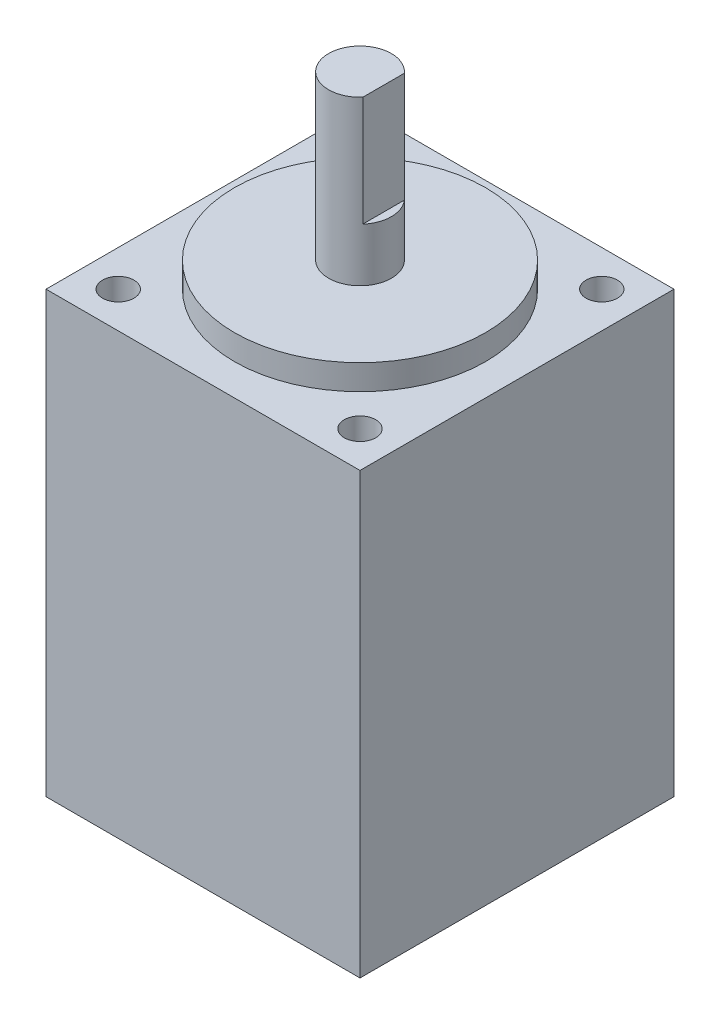
ISO-10303-21;
HEADER;
FILE_DESCRIPTION(('STEP AP214'),'2;1');
FILE_NAME('part.step','',(''),(''),'','','');
FILE_SCHEMA(('AUTOMOTIVE_DESIGN { 1 0 10303 214 1 1 1 1 }'));
ENDSEC;
DATA;
#1=APPLICATION_CONTEXT('core data for automotive mechanical design processes');
#2=APPLICATION_PROTOCOL_DEFINITION('international standard','automotive_design',2000,#1);
#3=PRODUCT_CONTEXT('',#1,'mechanical');
#4=PRODUCT('Part','Part','',(#3));
#5=PRODUCT_RELATED_PRODUCT_CATEGORY('part','',(#4));
#6=PRODUCT_DEFINITION_FORMATION('','',#4);
#7=PRODUCT_DEFINITION_CONTEXT('part definition',#1,'design');
#8=PRODUCT_DEFINITION('design','',#6,#7);
#9=PRODUCT_DEFINITION_SHAPE('','',#8);
#10=(LENGTH_UNIT() NAMED_UNIT(*) SI_UNIT(.MILLI.,.METRE.));
#11=(NAMED_UNIT(*) PLANE_ANGLE_UNIT() SI_UNIT($,.RADIAN.));
#12=(NAMED_UNIT(*) SI_UNIT($,.STERADIAN.) SOLID_ANGLE_UNIT());
#13=UNCERTAINTY_MEASURE_WITH_UNIT(LENGTH_MEASURE(1.E-05),#10,'distance_accuracy_value','');
#14=(GEOMETRIC_REPRESENTATION_CONTEXT(3) GLOBAL_UNCERTAINTY_ASSIGNED_CONTEXT((#13)) GLOBAL_UNIT_ASSIGNED_CONTEXT((#10,
#11,#12)) REPRESENTATION_CONTEXT('',''));
#15=CARTESIAN_POINT('',(0.,0.,0.));
#16=DIRECTION('',(0.,0.,1.));
#17=DIRECTION('',(1.,0.,0.));
#18=AXIS2_PLACEMENT_3D('',#15,#16,#17);
#19=CARTESIAN_POINT('',(10.,40.,-10.));
#20=DIRECTION('',(0.,-1.,0.));
#21=DIRECTION('',(0.,0.,-1.));
#22=AXIS2_PLACEMENT_3D('',#19,#20,#21);
#23=CYLINDRICAL_SURFACE('',#22,2.);
#24=CARTESIAN_POINT('',(10.,29.6,-10.));
#25=DIRECTION('',(0.,1.,0.));
#26=DIRECTION('',(0.,0.,1.));
#27=AXIS2_PLACEMENT_3D('',#24,#25,#26);
#28=CIRCLE('',#27,2.);
#29=CARTESIAN_POINT('',(10.,29.6,-8.));
#30=VERTEX_POINT('',#29);
#31=EDGE_CURVE('E12',#30,#30,#28,.T.);
#32=ORIENTED_EDGE('',*,*,#31,.T.);
#33=EDGE_LOOP('',(#32));
#34=FACE_BOUND('',#33,.T.);
#35=DIRECTION('',(0.,1.,0.));
#36=VECTOR('',#35,1.);
#37=CARTESIAN_POINT('',(11.5011107615072,33.,-8.67838489654235));
#38=LINE('',#37,#36);
#39=CARTESIAN_POINT('',(11.5011107615072,33.,-8.67838489654235));
#40=VERTEX_POINT('',#39);
#41=CARTESIAN_POINT('',(11.5011107615072,40.,-8.67838489654235));
#42=VERTEX_POINT('',#41);
#43=EDGE_CURVE('E106',#40,#42,#38,.T.);
#44=ORIENTED_EDGE('',*,*,#43,.T.);
#45=CARTESIAN_POINT('',(10.,40.,-10.));
#46=DIRECTION('',(0.,1.,0.));
#47=DIRECTION('',(0.,0.,1.));
#48=AXIS2_PLACEMENT_3D('',#45,#46,#47);
#49=CIRCLE('',#48,2.);
#50=CARTESIAN_POINT('',(11.5011107615072,40.,-11.3216151034577));
#51=VERTEX_POINT('',#50);
#52=EDGE_CURVE('E129',#51,#42,#49,.T.);
#53=ORIENTED_EDGE('',*,*,#52,.F.);
#54=DIRECTION('',(0.,1.,0.));
#55=VECTOR('',#54,1.);
#56=CARTESIAN_POINT('',(11.5011107615072,33.,-11.3216151034577));
#57=LINE('',#56,#55);
#58=CARTESIAN_POINT('',(11.5011107615072,33.,-11.3216151034577));
#59=VERTEX_POINT('',#58);
#60=EDGE_CURVE('E60',#59,#51,#57,.T.);
#61=ORIENTED_EDGE('',*,*,#60,.F.);
#62=CARTESIAN_POINT('',(10.,33.,-10.));
#63=DIRECTION('',(0.,1.,0.));
#64=DIRECTION('',(0.,0.,1.));
#65=AXIS2_PLACEMENT_3D('',#62,#63,#64);
#66=CIRCLE('',#65,2.);
#67=EDGE_CURVE('E117',#40,#59,#66,.T.);
#68=ORIENTED_EDGE('',*,*,#67,.F.);
#69=EDGE_LOOP('',(#44,#53,#61,#68));
#70=FACE_BOUND('',#69,.T.);
#71=ADVANCED_FACE('F42',(#34,#70),#23,.T.);
#72=CARTESIAN_POINT('',(10.,40.,-10.));
#73=DIRECTION('',(0.,1.,0.));
#74=DIRECTION('',(0.,0.,1.));
#75=AXIS2_PLACEMENT_3D('',#72,#73,#74);
#76=PLANE('',#75);
#77=ORIENTED_EDGE('',*,*,#52,.T.);
#78=DIRECTION('',(0.,0.,-1.));
#79=VECTOR('',#78,1.);
#80=CARTESIAN_POINT('',(11.5011107615072,40.,0.));
#81=LINE('',#80,#79);
#82=EDGE_CURVE('E111',#42,#51,#81,.T.);
#83=ORIENTED_EDGE('',*,*,#82,.T.);
#84=EDGE_LOOP('',(#77,#83));
#85=FACE_BOUND('',#84,.T.);
#86=ADVANCED_FACE('F220',(#85),#76,.T.);
#87=CARTESIAN_POINT('',(0.,28.,0.));
#88=DIRECTION('',(0.,-1.,0.));
#89=DIRECTION('',(0.,0.,-1.));
#90=AXIS2_PLACEMENT_3D('',#87,#88,#89);
#91=PLANE('',#90);
#92=CARTESIAN_POINT('',(10.,28.,-10.));
#93=DIRECTION('',(0.,1.,0.));
#94=DIRECTION('',(0.,0.,1.));
#95=AXIS2_PLACEMENT_3D('',#92,#93,#94);
#96=CIRCLE('',#95,8.);
#97=CARTESIAN_POINT('',(10.,28.,-1.99999999999999));
#98=VERTEX_POINT('',#97);
#99=EDGE_CURVE('E52',#98,#98,#96,.T.);
#100=ORIENTED_EDGE('',*,*,#99,.F.);
#101=EDGE_LOOP('',(#100));
#102=FACE_BOUND('',#101,.T.);
#103=DIRECTION('',(0.,0.,1.));
#104=VECTOR('',#103,1.);
#105=CARTESIAN_POINT('',(0.,28.,0.));
#106=LINE('',#105,#104);
#107=CARTESIAN_POINT('',(0.,28.,-20.));
#108=VERTEX_POINT('',#107);
#109=CARTESIAN_POINT('',(0.,28.,0.));
#110=VERTEX_POINT('',#109);
#111=EDGE_CURVE('E173',#108,#110,#106,.T.);
#112=ORIENTED_EDGE('',*,*,#111,.T.);
#113=DIRECTION('',(1.,0.,0.));
#114=VECTOR('',#113,1.);
#115=CARTESIAN_POINT('',(0.,28.,0.));
#116=LINE('',#115,#114);
#117=CARTESIAN_POINT('',(20.,28.,0.));
#118=VERTEX_POINT('',#117);
#119=EDGE_CURVE('E98',#110,#118,#116,.T.);
#120=ORIENTED_EDGE('',*,*,#119,.T.);
#121=DIRECTION('',(0.,0.,-1.));
#122=VECTOR('',#121,1.);
#123=CARTESIAN_POINT('',(20.,28.,0.));
#124=LINE('',#123,#122);
#125=CARTESIAN_POINT('',(20.,28.,-20.));
#126=VERTEX_POINT('',#125);
#127=EDGE_CURVE('E178',#118,#126,#124,.T.);
#128=ORIENTED_EDGE('',*,*,#127,.T.);
#129=DIRECTION('',(-1.,0.,0.));
#130=VECTOR('',#129,1.);
#131=CARTESIAN_POINT('',(0.,28.,-20.));
#132=LINE('',#131,#130);
#133=EDGE_CURVE('E69',#126,#108,#132,.T.);
#134=ORIENTED_EDGE('',*,*,#133,.T.);
#135=EDGE_LOOP('',(#112,#120,#128,#134));
#136=FACE_BOUND('',#135,.T.);
#137=CARTESIAN_POINT('',(2.3,28.,-17.7));
#138=DIRECTION('',(0.,1.,0.));
#139=DIRECTION('',(0.,0.,1.));
#140=AXIS2_PLACEMENT_3D('',#137,#138,#139);
#141=CIRCLE('',#140,1.);
#142=CARTESIAN_POINT('',(2.3,28.,-16.7));
#143=VERTEX_POINT('',#142);
#144=EDGE_CURVE('E165',#143,#143,#141,.T.);
#145=ORIENTED_EDGE('',*,*,#144,.F.);
#146=EDGE_LOOP('',(#145));
#147=FACE_BOUND('',#146,.T.);
#148=CARTESIAN_POINT('',(17.7,28.,-2.3));
#149=DIRECTION('',(0.,1.,0.));
#150=DIRECTION('',(0.,0.,1.));
#151=AXIS2_PLACEMENT_3D('',#148,#149,#150);
#152=CIRCLE('',#151,1.);
#153=CARTESIAN_POINT('',(17.7,28.,-1.3));
#154=VERTEX_POINT('',#153);
#155=EDGE_CURVE('E157',#154,#154,#152,.T.);
#156=ORIENTED_EDGE('',*,*,#155,.F.);
#157=EDGE_LOOP('',(#156));
#158=FACE_BOUND('',#157,.T.);
#159=CARTESIAN_POINT('',(17.7,28.,-17.7));
#160=DIRECTION('',(0.,1.,0.));
#161=DIRECTION('',(0.,0.,1.));
#162=AXIS2_PLACEMENT_3D('',#159,#160,#161);
#163=CIRCLE('',#162,1.);
#164=CARTESIAN_POINT('',(17.7,28.,-16.7));
#165=VERTEX_POINT('',#164);
#166=EDGE_CURVE('E149',#165,#165,#163,.T.);
#167=ORIENTED_EDGE('',*,*,#166,.F.);
#168=EDGE_LOOP('',(#167));
#169=FACE_BOUND('',#168,.T.);
#170=CARTESIAN_POINT('',(2.3,28.,-2.3));
#171=DIRECTION('',(0.,1.,0.));
#172=DIRECTION('',(0.,0.,1.));
#173=AXIS2_PLACEMENT_3D('',#170,#171,#172);
#174=CIRCLE('',#173,1.);
#175=CARTESIAN_POINT('',(2.3,28.,-1.3));
#176=VERTEX_POINT('',#175);
#177=EDGE_CURVE('E141',#176,#176,#174,.T.);
#178=ORIENTED_EDGE('',*,*,#177,.F.);
#179=EDGE_LOOP('',(#178));
#180=FACE_BOUND('',#179,.T.);
#181=ADVANCED_FACE('F217',(#102,#136,#147,#158,#169,#180),#91,.F.);
#182=CARTESIAN_POINT('',(0.,0.,0.));
#183=DIRECTION('',(0.,-1.,0.));
#184=DIRECTION('',(0.,0.,-1.));
#185=AXIS2_PLACEMENT_3D('',#182,#183,#184);
#186=PLANE('',#185);
#187=CARTESIAN_POINT('',(17.7,0.,-17.7));
#188=DIRECTION('',(0.,1.,0.));
#189=DIRECTION('',(0.,0.,1.));
#190=AXIS2_PLACEMENT_3D('',#187,#188,#189);
#191=CIRCLE('',#190,1.);
#192=CARTESIAN_POINT('',(17.7,0.,-16.7));
#193=VERTEX_POINT('',#192);
#194=EDGE_CURVE('E145',#193,#193,#191,.T.);
#195=ORIENTED_EDGE('',*,*,#194,.T.);
#196=EDGE_LOOP('',(#195));
#197=FACE_BOUND('',#196,.T.);
#198=CARTESIAN_POINT('',(2.3,0.,-17.7));
#199=DIRECTION('',(0.,1.,0.));
#200=DIRECTION('',(0.,0.,1.));
#201=AXIS2_PLACEMENT_3D('',#198,#199,#200);
#202=CIRCLE('',#201,1.);
#203=CARTESIAN_POINT('',(2.3,0.,-16.7));
#204=VERTEX_POINT('',#203);
#205=EDGE_CURVE('E161',#204,#204,#202,.T.);
#206=ORIENTED_EDGE('',*,*,#205,.T.);
#207=EDGE_LOOP('',(#206));
#208=FACE_BOUND('',#207,.T.);
#209=DIRECTION('',(0.,0.,1.));
#210=VECTOR('',#209,1.);
#211=CARTESIAN_POINT('',(0.,0.,0.));
#212=LINE('',#211,#210);
#213=CARTESIAN_POINT('',(0.,0.,-20.));
#214=VERTEX_POINT('',#213);
#215=CARTESIAN_POINT('',(0.,0.,0.));
#216=VERTEX_POINT('',#215);
#217=EDGE_CURVE('E169',#214,#216,#212,.T.);
#218=ORIENTED_EDGE('',*,*,#217,.F.);
#219=DIRECTION('',(-1.,0.,0.));
#220=VECTOR('',#219,1.);
#221=CARTESIAN_POINT('',(0.,0.,-20.));
#222=LINE('',#221,#220);
#223=CARTESIAN_POINT('',(20.,0.,-20.));
#224=VERTEX_POINT('',#223);
#225=EDGE_CURVE('E90',#224,#214,#222,.T.);
#226=ORIENTED_EDGE('',*,*,#225,.F.);
#227=DIRECTION('',(0.,0.,-1.));
#228=VECTOR('',#227,1.);
#229=CARTESIAN_POINT('',(20.,0.,0.));
#230=LINE('',#229,#228);
#231=CARTESIAN_POINT('',(20.,0.,0.));
#232=VERTEX_POINT('',#231);
#233=EDGE_CURVE('E190',#232,#224,#230,.T.);
#234=ORIENTED_EDGE('',*,*,#233,.F.);
#235=DIRECTION('',(1.,0.,0.));
#236=VECTOR('',#235,1.);
#237=CARTESIAN_POINT('',(0.,0.,0.));
#238=LINE('',#237,#236);
#239=EDGE_CURVE('E187',#216,#232,#238,.T.);
#240=ORIENTED_EDGE('',*,*,#239,.F.);
#241=EDGE_LOOP('',(#218,#226,#234,#240));
#242=FACE_BOUND('',#241,.T.);
#243=CARTESIAN_POINT('',(17.7,0.,-2.3));
#244=DIRECTION('',(0.,1.,0.));
#245=DIRECTION('',(0.,0.,1.));
#246=AXIS2_PLACEMENT_3D('',#243,#244,#245);
#247=CIRCLE('',#246,1.);
#248=CARTESIAN_POINT('',(17.7,0.,-1.3));
#249=VERTEX_POINT('',#248);
#250=EDGE_CURVE('E153',#249,#249,#247,.T.);
#251=ORIENTED_EDGE('',*,*,#250,.T.);
#252=EDGE_LOOP('',(#251));
#253=FACE_BOUND('',#252,.T.);
#254=CARTESIAN_POINT('',(2.3,0.,-2.3));
#255=DIRECTION('',(0.,1.,0.));
#256=DIRECTION('',(0.,0.,1.));
#257=AXIS2_PLACEMENT_3D('',#254,#255,#256);
#258=CIRCLE('',#257,1.);
#259=CARTESIAN_POINT('',(2.3,0.,-1.3));
#260=VERTEX_POINT('',#259);
#261=EDGE_CURVE('E137',#260,#260,#258,.T.);
#262=ORIENTED_EDGE('',*,*,#261,.T.);
#263=EDGE_LOOP('',(#262));
#264=FACE_BOUND('',#263,.T.);
#265=ADVANCED_FACE('F212',(#197,#208,#242,#253,#264),#186,.T.);
#266=CARTESIAN_POINT('',(0.,28.,0.));
#267=DIRECTION('',(1.,0.,0.));
#268=DIRECTION('',(0.,0.,-1.));
#269=AXIS2_PLACEMENT_3D('',#266,#267,#268);
#270=PLANE('',#269);
#271=ORIENTED_EDGE('',*,*,#217,.T.);
#272=DIRECTION('',(0.,-1.,0.));
#273=VECTOR('',#272,1.);
#274=CARTESIAN_POINT('',(0.,28.,0.));
#275=LINE('',#274,#273);
#276=EDGE_CURVE('E46',#110,#216,#275,.T.);
#277=ORIENTED_EDGE('',*,*,#276,.F.);
#278=ORIENTED_EDGE('',*,*,#111,.F.);
#279=DIRECTION('',(0.,-1.,0.));
#280=VECTOR('',#279,1.);
#281=CARTESIAN_POINT('',(0.,28.,-20.));
#282=LINE('',#281,#280);
#283=EDGE_CURVE('E183',#108,#214,#282,.T.);
#284=ORIENTED_EDGE('',*,*,#283,.T.);
#285=EDGE_LOOP('',(#271,#277,#278,#284));
#286=FACE_BOUND('',#285,.T.);
#287=ADVANCED_FACE('F44',(#286),#270,.F.);
#288=CARTESIAN_POINT('',(0.,28.,0.));
#289=DIRECTION('',(0.,0.,-1.));
#290=DIRECTION('',(-1.,0.,0.));
#291=AXIS2_PLACEMENT_3D('',#288,#289,#290);
#292=PLANE('',#291);
#293=ORIENTED_EDGE('',*,*,#239,.T.);
#294=DIRECTION('',(0.,-1.,0.));
#295=VECTOR('',#294,1.);
#296=CARTESIAN_POINT('',(20.,28.,0.));
#297=LINE('',#296,#295);
#298=EDGE_CURVE('E199',#118,#232,#297,.T.);
#299=ORIENTED_EDGE('',*,*,#298,.F.);
#300=ORIENTED_EDGE('',*,*,#119,.F.);
#301=ORIENTED_EDGE('',*,*,#276,.T.);
#302=EDGE_LOOP('',(#293,#299,#300,#301));
#303=FACE_BOUND('',#302,.T.);
#304=ADVANCED_FACE('F207',(#303),#292,.F.);
#305=CARTESIAN_POINT('',(20.,28.,0.));
#306=DIRECTION('',(-1.,0.,0.));
#307=DIRECTION('',(0.,0.,1.));
#308=AXIS2_PLACEMENT_3D('',#305,#306,#307);
#309=PLANE('',#308);
#310=ORIENTED_EDGE('',*,*,#233,.T.);
#311=DIRECTION('',(0.,-1.,0.));
#312=VECTOR('',#311,1.);
#313=CARTESIAN_POINT('',(20.,28.,-20.));
#314=LINE('',#313,#312);
#315=EDGE_CURVE('E197',#126,#224,#314,.T.);
#316=ORIENTED_EDGE('',*,*,#315,.F.);
#317=ORIENTED_EDGE('',*,*,#127,.F.);
#318=ORIENTED_EDGE('',*,*,#298,.T.);
#319=EDGE_LOOP('',(#310,#316,#317,#318));
#320=FACE_BOUND('',#319,.T.);
#321=ADVANCED_FACE('F215',(#320),#309,.F.);
#322=CARTESIAN_POINT('',(0.,28.,-20.));
#323=DIRECTION('',(0.,0.,1.));
#324=DIRECTION('',(1.,0.,0.));
#325=AXIS2_PLACEMENT_3D('',#322,#323,#324);
#326=PLANE('',#325);
#327=ORIENTED_EDGE('',*,*,#225,.T.);
#328=ORIENTED_EDGE('',*,*,#283,.F.);
#329=ORIENTED_EDGE('',*,*,#133,.F.);
#330=ORIENTED_EDGE('',*,*,#315,.T.);
#331=EDGE_LOOP('',(#327,#328,#329,#330));
#332=FACE_BOUND('',#331,.T.);
#333=ADVANCED_FACE('F216',(#332),#326,.F.);
#334=CARTESIAN_POINT('',(2.3,28.,-17.7));
#335=DIRECTION('',(0.,-1.,0.));
#336=DIRECTION('',(0.,0.,-1.));
#337=AXIS2_PLACEMENT_3D('',#334,#335,#336);
#338=CYLINDRICAL_SURFACE('',#337,1.);
#339=ORIENTED_EDGE('',*,*,#144,.T.);
#340=EDGE_LOOP('',(#339));
#341=FACE_BOUND('',#340,.T.);
#342=ORIENTED_EDGE('',*,*,#205,.F.);
#343=EDGE_LOOP('',(#342));
#344=FACE_BOUND('',#343,.T.);
#345=ADVANCED_FACE('F270',(#341,#344),#338,.F.);
#346=CARTESIAN_POINT('',(17.7,28.,-2.3));
#347=DIRECTION('',(0.,-1.,0.));
#348=DIRECTION('',(0.,0.,-1.));
#349=AXIS2_PLACEMENT_3D('',#346,#347,#348);
#350=CYLINDRICAL_SURFACE('',#349,1.);
#351=ORIENTED_EDGE('',*,*,#155,.T.);
#352=EDGE_LOOP('',(#351));
#353=FACE_BOUND('',#352,.T.);
#354=ORIENTED_EDGE('',*,*,#250,.F.);
#355=EDGE_LOOP('',(#354));
#356=FACE_BOUND('',#355,.T.);
#357=ADVANCED_FACE('F266',(#353,#356),#350,.F.);
#358=CARTESIAN_POINT('',(17.7,28.,-17.7));
#359=DIRECTION('',(0.,-1.,0.));
#360=DIRECTION('',(0.,0.,-1.));
#361=AXIS2_PLACEMENT_3D('',#358,#359,#360);
#362=CYLINDRICAL_SURFACE('',#361,1.);
#363=ORIENTED_EDGE('',*,*,#166,.T.);
#364=EDGE_LOOP('',(#363));
#365=FACE_BOUND('',#364,.T.);
#366=ORIENTED_EDGE('',*,*,#194,.F.);
#367=EDGE_LOOP('',(#366));
#368=FACE_BOUND('',#367,.T.);
#369=ADVANCED_FACE('F235',(#365,#368),#362,.F.);
#370=CARTESIAN_POINT('',(2.3,28.,-2.3));
#371=DIRECTION('',(0.,-1.,0.));
#372=DIRECTION('',(0.,0.,-1.));
#373=AXIS2_PLACEMENT_3D('',#370,#371,#372);
#374=CYLINDRICAL_SURFACE('',#373,1.);
#375=ORIENTED_EDGE('',*,*,#177,.T.);
#376=EDGE_LOOP('',(#375));
#377=FACE_BOUND('',#376,.T.);
#378=ORIENTED_EDGE('',*,*,#261,.F.);
#379=EDGE_LOOP('',(#378));
#380=FACE_BOUND('',#379,.T.);
#381=ADVANCED_FACE('F231',(#377,#380),#374,.F.);
#382=CARTESIAN_POINT('',(10.,29.6,-10.));
#383=DIRECTION('',(0.,-1.,0.));
#384=DIRECTION('',(0.,0.,-1.));
#385=AXIS2_PLACEMENT_3D('',#382,#383,#384);
#386=CYLINDRICAL_SURFACE('',#385,8.);
#387=CARTESIAN_POINT('',(10.,29.6,-10.));
#388=DIRECTION('',(0.,1.,0.));
#389=DIRECTION('',(0.,0.,1.));
#390=AXIS2_PLACEMENT_3D('',#387,#388,#389);
#391=CIRCLE('',#390,8.);
#392=CARTESIAN_POINT('',(10.,29.6,-1.99999999999999));
#393=VERTEX_POINT('',#392);
#394=EDGE_CURVE('E132',#393,#393,#391,.T.);
#395=ORIENTED_EDGE('',*,*,#394,.F.);
#396=EDGE_LOOP('',(#395));
#397=FACE_BOUND('',#396,.T.);
#398=ORIENTED_EDGE('',*,*,#99,.T.);
#399=EDGE_LOOP('',(#398));
#400=FACE_BOUND('',#399,.T.);
#401=ADVANCED_FACE('F234',(#397,#400),#386,.T.);
#402=CARTESIAN_POINT('',(0.,29.6,0.));
#403=DIRECTION('',(0.,1.,0.));
#404=DIRECTION('',(0.,0.,1.));
#405=AXIS2_PLACEMENT_3D('',#402,#403,#404);
#406=PLANE('',#405);
#407=ORIENTED_EDGE('',*,*,#31,.F.);
#408=EDGE_LOOP('',(#407));
#409=FACE_BOUND('',#408,.T.);
#410=ORIENTED_EDGE('',*,*,#394,.T.);
#411=EDGE_LOOP('',(#410));
#412=FACE_BOUND('',#411,.T.);
#413=ADVANCED_FACE('F257',(#409,#412),#406,.T.);
#414=CARTESIAN_POINT('',(11.5011107615072,33.,0.));
#415=DIRECTION('',(1.,0.,0.));
#416=DIRECTION('',(0.,0.,-1.));
#417=AXIS2_PLACEMENT_3D('',#414,#415,#416);
#418=PLANE('',#417);
#419=ORIENTED_EDGE('',*,*,#82,.F.);
#420=ORIENTED_EDGE('',*,*,#43,.F.);
#421=DIRECTION('',(0.,0.,-1.));
#422=VECTOR('',#421,1.);
#423=CARTESIAN_POINT('',(11.5011107615072,33.,0.));
#424=LINE('',#423,#422);
#425=EDGE_CURVE('E109',#40,#59,#424,.T.);
#426=ORIENTED_EDGE('',*,*,#425,.T.);
#427=ORIENTED_EDGE('',*,*,#60,.T.);
#428=EDGE_LOOP('',(#419,#420,#426,#427));
#429=FACE_BOUND('',#428,.T.);
#430=ADVANCED_FACE('F108',(#429),#418,.T.);
#431=CARTESIAN_POINT('',(0.,33.,0.));
#432=DIRECTION('',(0.,1.,0.));
#433=DIRECTION('',(0.,0.,1.));
#434=AXIS2_PLACEMENT_3D('',#431,#432,#433);
#435=PLANE('',#434);
#436=ORIENTED_EDGE('',*,*,#425,.F.);
#437=ORIENTED_EDGE('',*,*,#67,.T.);
#438=EDGE_LOOP('',(#436,#437));
#439=FACE_BOUND('',#438,.T.);
#440=ADVANCED_FACE('F120',(#439),#435,.T.);
#441=CLOSED_SHELL('',(#71,#86,#181,#265,#287,#304,#321,#333,#345,#357,#369,#381,#401,#413,#430,#440));
#442=MANIFOLD_SOLID_BREP('B2',#441);
#443=ADVANCED_BREP_SHAPE_REPRESENTATION('',(#18,#442),#14);
#444=SHAPE_DEFINITION_REPRESENTATION(#9,#443);
ENDSEC;
END-ISO-10303-21;
